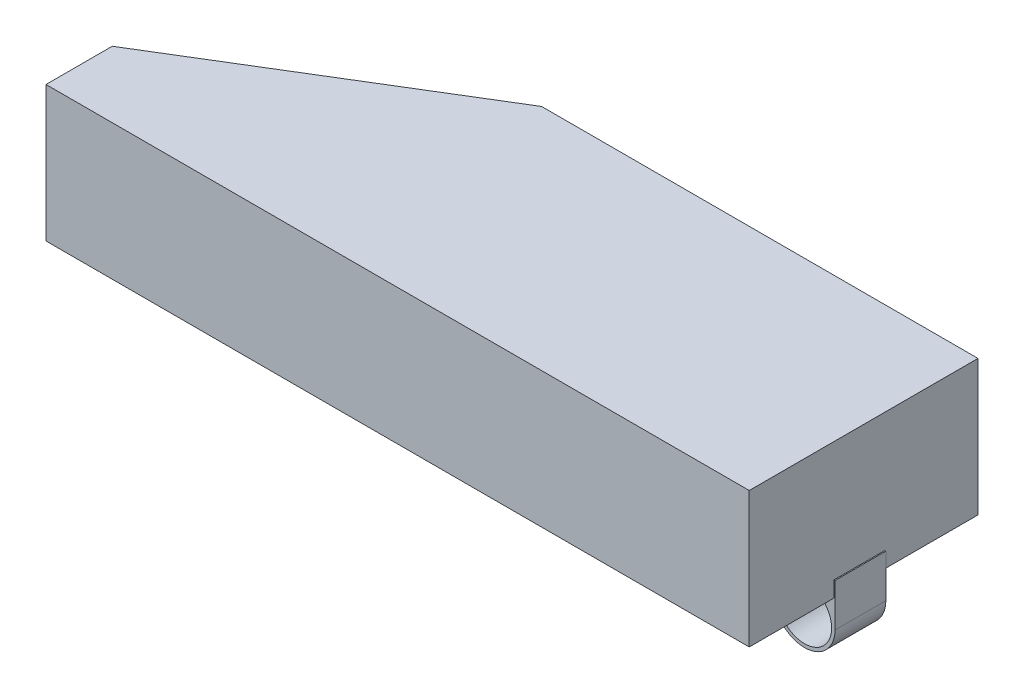
ISO-10303-21;
HEADER;
FILE_DESCRIPTION(('STEP AP214'),'2;1');
FILE_NAME('part.step','',(''),(''),'','','');
FILE_SCHEMA(('AUTOMOTIVE_DESIGN { 1 0 10303 214 1 1 1 1 }'));
ENDSEC;
DATA;
#1=APPLICATION_CONTEXT('core data for automotive mechanical design processes');
#2=APPLICATION_PROTOCOL_DEFINITION('international standard','automotive_design',2000,#1);
#3=PRODUCT_CONTEXT('',#1,'mechanical');
#4=PRODUCT('Part','Part','',(#3));
#5=PRODUCT_RELATED_PRODUCT_CATEGORY('part','',(#4));
#6=PRODUCT_DEFINITION_FORMATION('','',#4);
#7=PRODUCT_DEFINITION_CONTEXT('part definition',#1,'design');
#8=PRODUCT_DEFINITION('design','',#6,#7);
#9=PRODUCT_DEFINITION_SHAPE('','',#8);
#10=(LENGTH_UNIT() NAMED_UNIT(*) SI_UNIT(.MILLI.,.METRE.));
#11=(NAMED_UNIT(*) PLANE_ANGLE_UNIT() SI_UNIT($,.RADIAN.));
#12=(NAMED_UNIT(*) SI_UNIT($,.STERADIAN.) SOLID_ANGLE_UNIT());
#13=UNCERTAINTY_MEASURE_WITH_UNIT(LENGTH_MEASURE(1.E-05),#10,'distance_accuracy_value','');
#14=(GEOMETRIC_REPRESENTATION_CONTEXT(3) GLOBAL_UNCERTAINTY_ASSIGNED_CONTEXT((#13)) GLOBAL_UNIT_ASSIGNED_CONTEXT((#10,
#11,#12)) REPRESENTATION_CONTEXT('',''));
#15=CARTESIAN_POINT('',(0.,0.,0.));
#16=DIRECTION('',(0.,0.,1.));
#17=DIRECTION('',(1.,0.,0.));
#18=AXIS2_PLACEMENT_3D('',#15,#16,#17);
#19=CARTESIAN_POINT('',(0.,0.,0.));
#20=DIRECTION('',(0.,-1.,0.));
#21=DIRECTION('',(0.,0.,1.));
#22=AXIS2_PLACEMENT_3D('',#19,#20,#21);
#23=PLANE('',#22);
#24=DIRECTION('',(1.,0.,0.));
#25=VECTOR('',#24,1.);
#26=CARTESIAN_POINT('',(0.,0.,55.));
#27=LINE('',#26,#25);
#28=CARTESIAN_POINT('',(-35.3807674556755,0.,55.));
#29=VERTEX_POINT('',#28);
#30=CARTESIAN_POINT('',(-17.3807674556755,0.,55.));
#31=VERTEX_POINT('',#30);
#32=EDGE_CURVE('E274',#29,#31,#27,.T.);
#33=ORIENTED_EDGE('',*,*,#32,.F.);
#34=DIRECTION('',(0.,0.,-1.));
#35=VECTOR('',#34,1.);
#36=CARTESIAN_POINT('',(-35.3807674556755,0.,0.));
#37=LINE('',#36,#35);
#38=CARTESIAN_POINT('',(-35.3807674556755,0.,85.));
#39=VERTEX_POINT('',#38);
#40=EDGE_CURVE('E271',#39,#29,#37,.T.);
#41=ORIENTED_EDGE('',*,*,#40,.F.);
#42=DIRECTION('',(1.,0.,0.));
#43=VECTOR('',#42,1.);
#44=CARTESIAN_POINT('',(0.,0.,85.));
#45=LINE('',#44,#43);
#46=CARTESIAN_POINT('',(-17.3807674556755,0.,85.));
#47=VERTEX_POINT('',#46);
#48=EDGE_CURVE('E270',#39,#47,#45,.T.);
#49=ORIENTED_EDGE('',*,*,#48,.T.);
#50=CARTESIAN_POINT('',(0.,0.,85.));
#51=VERTEX_POINT('',#50);
#52=EDGE_CURVE('E267',#47,#51,#45,.T.);
#53=ORIENTED_EDGE('',*,*,#52,.T.);
#54=DIRECTION('',(0.,0.,-1.));
#55=VECTOR('',#54,1.);
#56=CARTESIAN_POINT('',(0.,0.,135.));
#57=LINE('',#56,#55);
#58=CARTESIAN_POINT('',(0.,0.,135.));
#59=VERTEX_POINT('',#58);
#60=EDGE_CURVE('E247',#59,#51,#57,.T.);
#61=ORIENTED_EDGE('',*,*,#60,.F.);
#62=DIRECTION('',(1.,0.,0.));
#63=VECTOR('',#62,1.);
#64=CARTESIAN_POINT('',(-415.,0.,135.));
#65=LINE('',#64,#63);
#66=CARTESIAN_POINT('',(-415.,0.,135.));
#67=VERTEX_POINT('',#66);
#68=EDGE_CURVE('E250',#67,#59,#65,.T.);
#69=ORIENTED_EDGE('',*,*,#68,.F.);
#70=DIRECTION('',(0.,0.,1.));
#71=VECTOR('',#70,1.);
#72=CARTESIAN_POINT('',(-415.,0.,95.9158718318107));
#73=LINE('',#72,#71);
#74=CARTESIAN_POINT('',(-415.,0.,95.9158718318107));
#75=VERTEX_POINT('',#74);
#76=EDGE_CURVE('E253',#75,#67,#73,.T.);
#77=ORIENTED_EDGE('',*,*,#76,.F.);
#78=DIRECTION('',(-0.854037132553677,0.,0.520212049283264));
#79=VECTOR('',#78,1.);
#80=CARTESIAN_POINT('',(-257.534328512037,0.,0.000206652732773205));
#81=LINE('',#80,#79);
#82=CARTESIAN_POINT('',(-257.534328512037,0.,0.000206652732773205));
#83=VERTEX_POINT('',#82);
#84=EDGE_CURVE('E234',#83,#75,#81,.T.);
#85=ORIENTED_EDGE('',*,*,#84,.F.);
#86=DIRECTION('',(0.999999999999678,0.,-8.02427909192227E-07));
#87=VECTOR('',#86,1.);
#88=CARTESIAN_POINT('',(-257.534328512037,0.,0.000206652732773205));
#89=LINE('',#88,#87);
#90=CARTESIAN_POINT('',(0.,0.,0.));
#91=VERTEX_POINT('',#90);
#92=EDGE_CURVE('E230',#83,#91,#89,.T.);
#93=ORIENTED_EDGE('',*,*,#92,.T.);
#94=CARTESIAN_POINT('',(0.,0.,55.));
#95=VERTEX_POINT('',#94);
#96=EDGE_CURVE('E246',#95,#91,#57,.T.);
#97=ORIENTED_EDGE('',*,*,#96,.F.);
#98=EDGE_CURVE('E277',#31,#95,#27,.T.);
#99=ORIENTED_EDGE('',*,*,#98,.F.);
#100=EDGE_LOOP('',(#33,#41,#49,#53,#61,#69,#77,#85,#93,#97,#99));
#101=FACE_BOUND('',#100,.T.);
#102=DIRECTION('',(0.,0.,-1.));
#103=VECTOR('',#102,1.);
#104=CARTESIAN_POINT('',(-235.380767455611,0.,0.));
#105=LINE('',#104,#103);
#106=CARTESIAN_POINT('',(-235.380767455611,0.,85.));
#107=VERTEX_POINT('',#106);
#108=CARTESIAN_POINT('',(-235.380767455611,0.,55.));
#109=VERTEX_POINT('',#108);
#110=EDGE_CURVE('E171',#107,#109,#105,.T.);
#111=ORIENTED_EDGE('',*,*,#110,.F.);
#112=DIRECTION('',(1.,0.,0.));
#113=VECTOR('',#112,1.);
#114=CARTESIAN_POINT('',(0.,0.,85.));
#115=LINE('',#114,#113);
#116=CARTESIAN_POINT('',(-217.380767455611,0.,85.));
#117=VERTEX_POINT('',#116);
#118=EDGE_CURVE('E284',#107,#117,#115,.T.);
#119=ORIENTED_EDGE('',*,*,#118,.T.);
#120=CARTESIAN_POINT('',(-199.380767455611,0.,85.));
#121=VERTEX_POINT('',#120);
#122=EDGE_CURVE('E281',#117,#121,#115,.T.);
#123=ORIENTED_EDGE('',*,*,#122,.T.);
#124=DIRECTION('',(0.,0.,1.));
#125=VECTOR('',#124,1.);
#126=CARTESIAN_POINT('',(-199.380767455611,0.,0.));
#127=LINE('',#126,#125);
#128=CARTESIAN_POINT('',(-199.380767455611,0.,55.));
#129=VERTEX_POINT('',#128);
#130=EDGE_CURVE('E285',#129,#121,#127,.T.);
#131=ORIENTED_EDGE('',*,*,#130,.F.);
#132=DIRECTION('',(1.,0.,0.));
#133=VECTOR('',#132,1.);
#134=CARTESIAN_POINT('',(0.,0.,55.));
#135=LINE('',#134,#133);
#136=CARTESIAN_POINT('',(-217.380767455611,0.,55.));
#137=VERTEX_POINT('',#136);
#138=EDGE_CURVE('E49',#137,#129,#135,.T.);
#139=ORIENTED_EDGE('',*,*,#138,.F.);
#140=EDGE_CURVE('E11',#109,#137,#135,.T.);
#141=ORIENTED_EDGE('',*,*,#140,.F.);
#142=EDGE_LOOP('',(#111,#119,#123,#131,#139,#141));
#143=FACE_BOUND('',#142,.T.);
#144=ADVANCED_FACE('F45',(#101,#143),#23,.T.);
#145=CARTESIAN_POINT('',(0.,80.,135.));
#146=DIRECTION('',(1.,0.,0.));
#147=DIRECTION('',(0.,0.,1.));
#148=AXIS2_PLACEMENT_3D('',#145,#146,#147);
#149=PLANE('',#148);
#150=ORIENTED_EDGE('',*,*,#96,.T.);
#151=DIRECTION('',(0.,-1.,0.));
#152=VECTOR('',#151,1.);
#153=CARTESIAN_POINT('',(0.,80.,0.));
#154=LINE('',#153,#152);
#155=CARTESIAN_POINT('',(0.,80.,0.));
#156=VERTEX_POINT('',#155);
#157=EDGE_CURVE('E265',#156,#91,#154,.T.);
#158=ORIENTED_EDGE('',*,*,#157,.F.);
#159=DIRECTION('',(0.,0.,-1.));
#160=VECTOR('',#159,1.);
#161=CARTESIAN_POINT('',(0.,80.,135.));
#162=LINE('',#161,#160);
#163=CARTESIAN_POINT('',(0.,80.,135.));
#164=VERTEX_POINT('',#163);
#165=EDGE_CURVE('E233',#164,#156,#162,.T.);
#166=ORIENTED_EDGE('',*,*,#165,.F.);
#167=DIRECTION('',(0.,-1.,0.));
#168=VECTOR('',#167,1.);
#169=CARTESIAN_POINT('',(0.,80.,135.));
#170=LINE('',#169,#168);
#171=EDGE_CURVE('E263',#164,#59,#170,.T.);
#172=ORIENTED_EDGE('',*,*,#171,.T.);
#173=ORIENTED_EDGE('',*,*,#60,.T.);
#174=DIRECTION('',(0.,1.,0.));
#175=VECTOR('',#174,1.);
#176=CARTESIAN_POINT('',(0.,80.,85.));
#177=LINE('',#176,#175);
#178=CARTESIAN_POINT('',(0.,9.30766354136547,85.));
#179=VERTEX_POINT('',#178);
#180=EDGE_CURVE('E219',#51,#179,#177,.T.);
#181=ORIENTED_EDGE('',*,*,#180,.T.);
#182=DIRECTION('',(0.,0.,1.));
#183=VECTOR('',#182,1.);
#184=CARTESIAN_POINT('',(0.,9.30766354136547,135.));
#185=LINE('',#184,#183);
#186=CARTESIAN_POINT('',(0.,9.30766354136547,55.));
#187=VERTEX_POINT('',#186);
#188=EDGE_CURVE('E278',#187,#179,#185,.T.);
#189=ORIENTED_EDGE('',*,*,#188,.F.);
#190=DIRECTION('',(0.,1.,0.));
#191=VECTOR('',#190,1.);
#192=CARTESIAN_POINT('',(0.,80.,55.));
#193=LINE('',#192,#191);
#194=EDGE_CURVE('E227',#95,#187,#193,.T.);
#195=ORIENTED_EDGE('',*,*,#194,.F.);
#196=EDGE_LOOP('',(#150,#158,#166,#172,#173,#181,#189,#195));
#197=FACE_BOUND('',#196,.T.);
#198=ADVANCED_FACE('F314',(#197),#149,.T.);
#199=CARTESIAN_POINT('',(-257.534328512037,80.,0.000206652732773205));
#200=DIRECTION('',(8.02427909192227E-07,0.,0.999999999999678));
#201=DIRECTION('',(-0.999999999999678,0.,8.02427909192227E-07));
#202=AXIS2_PLACEMENT_3D('',#199,#200,#201);
#203=PLANE('',#202);
#204=ORIENTED_EDGE('',*,*,#92,.F.);
#205=DIRECTION('',(0.,-1.,0.));
#206=VECTOR('',#205,1.);
#207=CARTESIAN_POINT('',(-257.534328512037,80.,0.000206652732773205));
#208=LINE('',#207,#206);
#209=CARTESIAN_POINT('',(-257.534328512037,80.,0.000206652732773205));
#210=VERTEX_POINT('',#209);
#211=EDGE_CURVE('E243',#210,#83,#208,.T.);
#212=ORIENTED_EDGE('',*,*,#211,.F.);
#213=DIRECTION('',(0.999999999999678,0.,-8.02427909192227E-07));
#214=VECTOR('',#213,1.);
#215=CARTESIAN_POINT('',(-257.534328512037,80.,0.000206652732773205));
#216=LINE('',#215,#214);
#217=EDGE_CURVE('E231',#210,#156,#216,.T.);
#218=ORIENTED_EDGE('',*,*,#217,.T.);
#219=ORIENTED_EDGE('',*,*,#157,.T.);
#220=EDGE_LOOP('',(#204,#212,#218,#219));
#221=FACE_BOUND('',#220,.T.);
#222=ADVANCED_FACE('F47',(#221),#203,.F.);
#223=CARTESIAN_POINT('',(-415.,80.,135.));
#224=DIRECTION('',(0.,0.,1.));
#225=DIRECTION('',(-1.,0.,0.));
#226=AXIS2_PLACEMENT_3D('',#223,#224,#225);
#227=PLANE('',#226);
#228=ORIENTED_EDGE('',*,*,#68,.T.);
#229=ORIENTED_EDGE('',*,*,#171,.F.);
#230=DIRECTION('',(1.,0.,0.));
#231=VECTOR('',#230,1.);
#232=CARTESIAN_POINT('',(-415.,80.,135.));
#233=LINE('',#232,#231);
#234=CARTESIAN_POINT('',(-415.,80.,135.));
#235=VERTEX_POINT('',#234);
#236=EDGE_CURVE('E237',#235,#164,#233,.T.);
#237=ORIENTED_EDGE('',*,*,#236,.F.);
#238=DIRECTION('',(0.,-1.,0.));
#239=VECTOR('',#238,1.);
#240=CARTESIAN_POINT('',(-415.,80.,135.));
#241=LINE('',#240,#239);
#242=EDGE_CURVE('E261',#235,#67,#241,.T.);
#243=ORIENTED_EDGE('',*,*,#242,.T.);
#244=EDGE_LOOP('',(#228,#229,#237,#243));
#245=FACE_BOUND('',#244,.T.);
#246=ADVANCED_FACE('F333',(#245),#227,.T.);
#247=CARTESIAN_POINT('',(-415.,80.,95.9158718318107));
#248=DIRECTION('',(-1.,0.,0.));
#249=DIRECTION('',(0.,0.,-1.));
#250=AXIS2_PLACEMENT_3D('',#247,#248,#249);
#251=PLANE('',#250);
#252=ORIENTED_EDGE('',*,*,#76,.T.);
#253=ORIENTED_EDGE('',*,*,#242,.F.);
#254=DIRECTION('',(0.,0.,1.));
#255=VECTOR('',#254,1.);
#256=CARTESIAN_POINT('',(-415.,80.,95.9158718318107));
#257=LINE('',#256,#255);
#258=CARTESIAN_POINT('',(-415.,80.,95.9158718318107));
#259=VERTEX_POINT('',#258);
#260=EDGE_CURVE('E239',#259,#235,#257,.T.);
#261=ORIENTED_EDGE('',*,*,#260,.F.);
#262=DIRECTION('',(0.,-1.,0.));
#263=VECTOR('',#262,1.);
#264=CARTESIAN_POINT('',(-415.,80.,95.9158718318107));
#265=LINE('',#264,#263);
#266=EDGE_CURVE('E259',#259,#75,#265,.T.);
#267=ORIENTED_EDGE('',*,*,#266,.T.);
#268=EDGE_LOOP('',(#252,#253,#261,#267));
#269=FACE_BOUND('',#268,.T.);
#270=ADVANCED_FACE('F329',(#269),#251,.T.);
#271=CARTESIAN_POINT('',(-257.534328512037,80.,0.000206652732773205));
#272=DIRECTION('',(-0.520212049283264,0.,-0.854037132553677));
#273=DIRECTION('',(0.854037132553677,0.,-0.520212049283264));
#274=AXIS2_PLACEMENT_3D('',#271,#272,#273);
#275=PLANE('',#274);
#276=ORIENTED_EDGE('',*,*,#84,.T.);
#277=ORIENTED_EDGE('',*,*,#266,.F.);
#278=DIRECTION('',(-0.854037132553677,0.,0.520212049283264));
#279=VECTOR('',#278,1.);
#280=CARTESIAN_POINT('',(-257.534328512037,80.,0.000206652732773205));
#281=LINE('',#280,#279);
#282=EDGE_CURVE('E241',#210,#259,#281,.T.);
#283=ORIENTED_EDGE('',*,*,#282,.F.);
#284=ORIENTED_EDGE('',*,*,#211,.T.);
#285=EDGE_LOOP('',(#276,#277,#283,#284));
#286=FACE_BOUND('',#285,.T.);
#287=ADVANCED_FACE('F326',(#286),#275,.T.);
#288=CARTESIAN_POINT('',(0.,80.,0.));
#289=DIRECTION('',(0.,-1.,0.));
#290=DIRECTION('',(0.,0.,1.));
#291=AXIS2_PLACEMENT_3D('',#288,#289,#290);
#292=PLANE('',#291);
#293=ORIENTED_EDGE('',*,*,#217,.F.);
#294=ORIENTED_EDGE('',*,*,#282,.T.);
#295=ORIENTED_EDGE('',*,*,#260,.T.);
#296=ORIENTED_EDGE('',*,*,#236,.T.);
#297=ORIENTED_EDGE('',*,*,#165,.T.);
#298=EDGE_LOOP('',(#293,#294,#295,#296,#297));
#299=FACE_BOUND('',#298,.T.);
#300=ADVANCED_FACE('F324',(#299),#292,.F.);
#301=CARTESIAN_POINT('',(-35.3807674556755,0.,55.));
#302=DIRECTION('',(1.,0.,0.));
#303=DIRECTION('',(0.,0.,1.));
#304=AXIS2_PLACEMENT_3D('',#301,#302,#303);
#305=PLANE('',#304);
#306=ORIENTED_EDGE('',*,*,#40,.T.);
#307=DIRECTION('',(0.,-1.,0.));
#308=VECTOR('',#307,1.);
#309=CARTESIAN_POINT('',(-35.3807674556755,0.,55.));
#310=LINE('',#309,#308);
#311=CARTESIAN_POINT('',(-35.3807674556755,-16.,55.));
#312=VERTEX_POINT('',#311);
#313=EDGE_CURVE('E194',#29,#312,#310,.T.);
#314=ORIENTED_EDGE('',*,*,#313,.T.);
#315=DIRECTION('',(0.,0.,1.));
#316=VECTOR('',#315,1.);
#317=CARTESIAN_POINT('',(-35.3807674556755,-16.,55.));
#318=LINE('',#317,#316);
#319=CARTESIAN_POINT('',(-35.3807674556755,-16.,85.));
#320=VERTEX_POINT('',#319);
#321=EDGE_CURVE('E216',#312,#320,#318,.T.);
#322=ORIENTED_EDGE('',*,*,#321,.T.);
#323=DIRECTION('',(0.,-1.,0.));
#324=VECTOR('',#323,1.);
#325=CARTESIAN_POINT('',(-35.3807674556755,0.,85.));
#326=LINE('',#325,#324);
#327=EDGE_CURVE('E207',#39,#320,#326,.T.);
#328=ORIENTED_EDGE('',*,*,#327,.F.);
#329=EDGE_LOOP('',(#306,#314,#322,#328));
#330=FACE_BOUND('',#329,.T.);
#331=ADVANCED_FACE('F370',(#330),#305,.F.);
#332=CARTESIAN_POINT('',(-17.3807674556755,-16.,55.));
#333=DIRECTION('',(0.,0.,1.));
#334=DIRECTION('',(-1.,0.,0.));
#335=AXIS2_PLACEMENT_3D('',#332,#333,#334);
#336=CYLINDRICAL_SURFACE('',#335,18.);
#337=CARTESIAN_POINT('',(-17.3807674556755,-16.,85.));
#338=DIRECTION('',(0.,0.,-1.));
#339=DIRECTION('',(-1.,0.,0.));
#340=AXIS2_PLACEMENT_3D('',#337,#338,#339);
#341=CIRCLE('',#340,18.);
#342=CARTESIAN_POINT('',(0.619232544324545,-16.,85.));
#343=VERTEX_POINT('',#342);
#344=EDGE_CURVE('E195',#343,#320,#341,.T.);
#345=ORIENTED_EDGE('',*,*,#344,.T.);
#346=ORIENTED_EDGE('',*,*,#321,.F.);
#347=CARTESIAN_POINT('',(-17.3807674556755,-16.,55.));
#348=DIRECTION('',(0.,0.,-1.));
#349=DIRECTION('',(-1.,0.,0.));
#350=AXIS2_PLACEMENT_3D('',#347,#348,#349);
#351=CIRCLE('',#350,18.);
#352=CARTESIAN_POINT('',(0.619232544324545,-16.,55.));
#353=VERTEX_POINT('',#352);
#354=EDGE_CURVE('E203',#353,#312,#351,.T.);
#355=ORIENTED_EDGE('',*,*,#354,.F.);
#356=DIRECTION('',(0.,0.,1.));
#357=VECTOR('',#356,1.);
#358=CARTESIAN_POINT('',(0.619232544324545,-16.,55.));
#359=LINE('',#358,#357);
#360=EDGE_CURVE('E220',#353,#343,#359,.T.);
#361=ORIENTED_EDGE('',*,*,#360,.T.);
#362=EDGE_LOOP('',(#345,#346,#355,#361));
#363=FACE_BOUND('',#362,.T.);
#364=ADVANCED_FACE('F387',(#363),#336,.T.);
#365=CARTESIAN_POINT('',(0.619232544324545,0.,55.));
#366=DIRECTION('',(-1.,0.,0.));
#367=DIRECTION('',(0.,0.,-1.));
#368=AXIS2_PLACEMENT_3D('',#365,#366,#367);
#369=PLANE('',#368);
#370=DIRECTION('',(0.,1.,0.));
#371=VECTOR('',#370,1.);
#372=CARTESIAN_POINT('',(0.619232544324545,0.,85.));
#373=LINE('',#372,#371);
#374=CARTESIAN_POINT('',(0.619232544324545,9.30766354136547,85.));
#375=VERTEX_POINT('',#374);
#376=EDGE_CURVE('E212',#343,#375,#373,.T.);
#377=ORIENTED_EDGE('',*,*,#376,.F.);
#378=ORIENTED_EDGE('',*,*,#360,.F.);
#379=DIRECTION('',(0.,1.,0.));
#380=VECTOR('',#379,1.);
#381=CARTESIAN_POINT('',(0.619232544324545,0.,55.));
#382=LINE('',#381,#380);
#383=CARTESIAN_POINT('',(0.619232544324545,9.30766354136547,55.));
#384=VERTEX_POINT('',#383);
#385=EDGE_CURVE('E200',#353,#384,#382,.T.);
#386=ORIENTED_EDGE('',*,*,#385,.T.);
#387=DIRECTION('',(0.,0.,1.));
#388=VECTOR('',#387,1.);
#389=CARTESIAN_POINT('',(0.619232544324545,9.30766354136547,55.));
#390=LINE('',#389,#388);
#391=EDGE_CURVE('E205',#384,#375,#390,.T.);
#392=ORIENTED_EDGE('',*,*,#391,.T.);
#393=EDGE_LOOP('',(#377,#378,#386,#392));
#394=FACE_BOUND('',#393,.T.);
#395=ADVANCED_FACE('F380',(#394),#369,.F.);
#396=CARTESIAN_POINT('',(-17.3807674556755,-16.,55.));
#397=DIRECTION('',(0.,0.,1.));
#398=DIRECTION('',(-1.,0.,0.));
#399=AXIS2_PLACEMENT_3D('',#396,#397,#398);
#400=CYLINDRICAL_SURFACE('',#399,16.);
#401=CARTESIAN_POINT('',(-17.3807674556755,-16.,85.));
#402=DIRECTION('',(0.,0.,-1.));
#403=DIRECTION('',(-1.,0.,0.));
#404=AXIS2_PLACEMENT_3D('',#401,#402,#403);
#405=CIRCLE('',#404,16.);
#406=EDGE_CURVE('E187',#47,#47,#405,.T.);
#407=ORIENTED_EDGE('',*,*,#406,.F.);
#408=EDGE_LOOP('',(#407));
#409=FACE_BOUND('',#408,.T.);
#410=CARTESIAN_POINT('',(-17.3807674556755,-16.,55.));
#411=DIRECTION('',(0.,0.,-1.));
#412=DIRECTION('',(-1.,0.,0.));
#413=AXIS2_PLACEMENT_3D('',#410,#411,#412);
#414=CIRCLE('',#413,16.);
#415=EDGE_CURVE('E192',#31,#31,#414,.T.);
#416=ORIENTED_EDGE('',*,*,#415,.T.);
#417=EDGE_LOOP('',(#416));
#418=FACE_BOUND('',#417,.T.);
#419=ADVANCED_FACE('F376',(#409,#418),#400,.F.);
#420=CARTESIAN_POINT('',(0.,9.30766354136547,55.));
#421=DIRECTION('',(0.,-1.,0.));
#422=DIRECTION('',(0.,0.,1.));
#423=AXIS2_PLACEMENT_3D('',#420,#421,#422);
#424=PLANE('',#423);
#425=ORIENTED_EDGE('',*,*,#188,.T.);
#426=DIRECTION('',(-1.,0.,0.));
#427=VECTOR('',#426,1.);
#428=CARTESIAN_POINT('',(0.,9.30766354136547,85.));
#429=LINE('',#428,#427);
#430=EDGE_CURVE('E210',#375,#179,#429,.T.);
#431=ORIENTED_EDGE('',*,*,#430,.F.);
#432=ORIENTED_EDGE('',*,*,#391,.F.);
#433=DIRECTION('',(-1.,0.,0.));
#434=VECTOR('',#433,1.);
#435=CARTESIAN_POINT('',(0.,9.30766354136547,55.));
#436=LINE('',#435,#434);
#437=EDGE_CURVE('E198',#384,#187,#436,.T.);
#438=ORIENTED_EDGE('',*,*,#437,.T.);
#439=EDGE_LOOP('',(#425,#431,#432,#438));
#440=FACE_BOUND('',#439,.T.);
#441=ADVANCED_FACE('F379',(#440),#424,.F.);
#442=CARTESIAN_POINT('',(0.,0.,55.));
#443=DIRECTION('',(0.,0.,1.));
#444=DIRECTION('',(-1.,0.,0.));
#445=AXIS2_PLACEMENT_3D('',#442,#443,#444);
#446=PLANE('',#445);
#447=ORIENTED_EDGE('',*,*,#194,.T.);
#448=ORIENTED_EDGE('',*,*,#437,.F.);
#449=ORIENTED_EDGE('',*,*,#385,.F.);
#450=ORIENTED_EDGE('',*,*,#354,.T.);
#451=ORIENTED_EDGE('',*,*,#313,.F.);
#452=ORIENTED_EDGE('',*,*,#32,.T.);
#453=ORIENTED_EDGE('',*,*,#415,.F.);
#454=ORIENTED_EDGE('',*,*,#98,.T.);
#455=EDGE_LOOP('',(#447,#448,#449,#450,#451,#452,#453,#454));
#456=FACE_BOUND('',#455,.T.);
#457=ADVANCED_FACE('F366',(#456),#446,.F.);
#458=CARTESIAN_POINT('',(0.,0.,85.));
#459=DIRECTION('',(0.,0.,1.));
#460=DIRECTION('',(-1.,0.,0.));
#461=AXIS2_PLACEMENT_3D('',#458,#459,#460);
#462=PLANE('',#461);
#463=ORIENTED_EDGE('',*,*,#52,.F.);
#464=ORIENTED_EDGE('',*,*,#406,.T.);
#465=ORIENTED_EDGE('',*,*,#48,.F.);
#466=ORIENTED_EDGE('',*,*,#327,.T.);
#467=ORIENTED_EDGE('',*,*,#344,.F.);
#468=ORIENTED_EDGE('',*,*,#376,.T.);
#469=ORIENTED_EDGE('',*,*,#430,.T.);
#470=ORIENTED_EDGE('',*,*,#180,.F.);
#471=EDGE_LOOP('',(#463,#464,#465,#466,#467,#468,#469,#470));
#472=FACE_BOUND('',#471,.T.);
#473=ADVANCED_FACE('F310',(#472),#462,.T.);
#474=CARTESIAN_POINT('',(-217.380767455611,-16.,55.));
#475=DIRECTION('',(0.,0.,1.));
#476=DIRECTION('',(-1.,0.,0.));
#477=AXIS2_PLACEMENT_3D('',#474,#475,#476);
#478=CYLINDRICAL_SURFACE('',#477,18.);
#479=CARTESIAN_POINT('',(-217.380767455611,-16.,85.));
#480=DIRECTION('',(0.,0.,-1.));
#481=DIRECTION('',(-1.,0.,0.));
#482=AXIS2_PLACEMENT_3D('',#479,#480,#481);
#483=CIRCLE('',#482,18.);
#484=CARTESIAN_POINT('',(-199.380767455611,-16.,85.));
#485=VERTEX_POINT('',#484);
#486=CARTESIAN_POINT('',(-235.380767455611,-16.,85.));
#487=VERTEX_POINT('',#486);
#488=EDGE_CURVE('E184',#485,#487,#483,.T.);
#489=ORIENTED_EDGE('',*,*,#488,.T.);
#490=DIRECTION('',(0.,0.,1.));
#491=VECTOR('',#490,1.);
#492=CARTESIAN_POINT('',(-235.380767455611,-16.,55.));
#493=LINE('',#492,#491);
#494=CARTESIAN_POINT('',(-235.380767455611,-16.,55.));
#495=VERTEX_POINT('',#494);
#496=EDGE_CURVE('E168',#495,#487,#493,.T.);
#497=ORIENTED_EDGE('',*,*,#496,.F.);
#498=CARTESIAN_POINT('',(-217.380767455611,-16.,55.));
#499=DIRECTION('',(0.,0.,-1.));
#500=DIRECTION('',(-1.,0.,0.));
#501=AXIS2_PLACEMENT_3D('',#498,#499,#500);
#502=CIRCLE('',#501,18.);
#503=CARTESIAN_POINT('',(-199.380767455611,-16.,55.));
#504=VERTEX_POINT('',#503);
#505=EDGE_CURVE('E174',#504,#495,#502,.T.);
#506=ORIENTED_EDGE('',*,*,#505,.F.);
#507=DIRECTION('',(0.,0.,1.));
#508=VECTOR('',#507,1.);
#509=CARTESIAN_POINT('',(-199.380767455611,-16.,55.));
#510=LINE('',#509,#508);
#511=EDGE_CURVE('E185',#504,#485,#510,.T.);
#512=ORIENTED_EDGE('',*,*,#511,.T.);
#513=EDGE_LOOP('',(#489,#497,#506,#512));
#514=FACE_BOUND('',#513,.T.);
#515=ADVANCED_FACE('F182',(#514),#478,.T.);
#516=CARTESIAN_POINT('',(-199.380767455611,0.,55.));
#517=DIRECTION('',(-1.,0.,0.));
#518=DIRECTION('',(0.,0.,-1.));
#519=AXIS2_PLACEMENT_3D('',#516,#517,#518);
#520=PLANE('',#519);
#521=ORIENTED_EDGE('',*,*,#130,.T.);
#522=DIRECTION('',(0.,1.,0.));
#523=VECTOR('',#522,1.);
#524=CARTESIAN_POINT('',(-199.380767455611,0.,85.));
#525=LINE('',#524,#523);
#526=EDGE_CURVE('E295',#485,#121,#525,.T.);
#527=ORIENTED_EDGE('',*,*,#526,.F.);
#528=ORIENTED_EDGE('',*,*,#511,.F.);
#529=DIRECTION('',(0.,1.,0.));
#530=VECTOR('',#529,1.);
#531=CARTESIAN_POINT('',(-199.380767455611,0.,55.));
#532=LINE('',#531,#530);
#533=EDGE_CURVE('E65',#504,#129,#532,.T.);
#534=ORIENTED_EDGE('',*,*,#533,.T.);
#535=EDGE_LOOP('',(#521,#527,#528,#534));
#536=FACE_BOUND('',#535,.T.);
#537=ADVANCED_FACE('F301',(#536),#520,.F.);
#538=CARTESIAN_POINT('',(-235.380767455611,0.,55.));
#539=DIRECTION('',(1.,0.,0.));
#540=DIRECTION('',(0.,0.,1.));
#541=AXIS2_PLACEMENT_3D('',#538,#539,#540);
#542=PLANE('',#541);
#543=ORIENTED_EDGE('',*,*,#110,.T.);
#544=DIRECTION('',(0.,-1.,0.));
#545=VECTOR('',#544,1.);
#546=CARTESIAN_POINT('',(-235.380767455611,0.,55.));
#547=LINE('',#546,#545);
#548=EDGE_CURVE('E164',#109,#495,#547,.T.);
#549=ORIENTED_EDGE('',*,*,#548,.T.);
#550=ORIENTED_EDGE('',*,*,#496,.T.);
#551=DIRECTION('',(0.,-1.,0.));
#552=VECTOR('',#551,1.);
#553=CARTESIAN_POINT('',(-235.380767455611,0.,85.));
#554=LINE('',#553,#552);
#555=EDGE_CURVE('E296',#107,#487,#554,.T.);
#556=ORIENTED_EDGE('',*,*,#555,.F.);
#557=EDGE_LOOP('',(#543,#549,#550,#556));
#558=FACE_BOUND('',#557,.T.);
#559=ADVANCED_FACE('F166',(#558),#542,.F.);
#560=CARTESIAN_POINT('',(-217.380767455611,-16.,55.));
#561=DIRECTION('',(0.,0.,1.));
#562=DIRECTION('',(-1.,0.,0.));
#563=AXIS2_PLACEMENT_3D('',#560,#561,#562);
#564=CYLINDRICAL_SURFACE('',#563,16.);
#565=CARTESIAN_POINT('',(-217.380767455611,-16.,85.));
#566=DIRECTION('',(0.,0.,-1.));
#567=DIRECTION('',(-1.,0.,0.));
#568=AXIS2_PLACEMENT_3D('',#565,#566,#567);
#569=CIRCLE('',#568,16.);
#570=EDGE_CURVE('E180',#117,#117,#569,.T.);
#571=ORIENTED_EDGE('',*,*,#570,.F.);
#572=EDGE_LOOP('',(#571));
#573=FACE_BOUND('',#572,.T.);
#574=CARTESIAN_POINT('',(-217.380767455611,-16.,55.));
#575=DIRECTION('',(0.,0.,-1.));
#576=DIRECTION('',(-1.,0.,0.));
#577=AXIS2_PLACEMENT_3D('',#574,#575,#576);
#578=CIRCLE('',#577,16.);
#579=EDGE_CURVE('E58',#137,#137,#578,.T.);
#580=ORIENTED_EDGE('',*,*,#579,.T.);
#581=EDGE_LOOP('',(#580));
#582=FACE_BOUND('',#581,.T.);
#583=ADVANCED_FACE('F308',(#573,#582),#564,.F.);
#584=CARTESIAN_POINT('',(0.,0.,55.));
#585=DIRECTION('',(0.,0.,1.));
#586=DIRECTION('',(-1.,0.,0.));
#587=AXIS2_PLACEMENT_3D('',#584,#585,#586);
#588=PLANE('',#587);
#589=ORIENTED_EDGE('',*,*,#140,.T.);
#590=ORIENTED_EDGE('',*,*,#579,.F.);
#591=ORIENTED_EDGE('',*,*,#138,.T.);
#592=ORIENTED_EDGE('',*,*,#533,.F.);
#593=ORIENTED_EDGE('',*,*,#505,.T.);
#594=ORIENTED_EDGE('',*,*,#548,.F.);
#595=EDGE_LOOP('',(#589,#590,#591,#592,#593,#594));
#596=FACE_BOUND('',#595,.T.);
#597=ADVANCED_FACE('F177',(#596),#588,.F.);
#598=CARTESIAN_POINT('',(0.,0.,85.));
#599=DIRECTION('',(0.,0.,1.));
#600=DIRECTION('',(-1.,0.,0.));
#601=AXIS2_PLACEMENT_3D('',#598,#599,#600);
#602=PLANE('',#601);
#603=ORIENTED_EDGE('',*,*,#555,.T.);
#604=ORIENTED_EDGE('',*,*,#488,.F.);
#605=ORIENTED_EDGE('',*,*,#526,.T.);
#606=ORIENTED_EDGE('',*,*,#122,.F.);
#607=ORIENTED_EDGE('',*,*,#570,.T.);
#608=ORIENTED_EDGE('',*,*,#118,.F.);
#609=EDGE_LOOP('',(#603,#604,#605,#606,#607,#608));
#610=FACE_BOUND('',#609,.T.);
#611=ADVANCED_FACE('F293',(#610),#602,.T.);
#612=CLOSED_SHELL('',(#144,#198,#222,#246,#270,#287,#300,#331,#364,#395,#419,#441,#457,#473,
#515,#537,#559,#583,#597,#611));
#613=MANIFOLD_SOLID_BREP('B2',#612);
#614=ADVANCED_BREP_SHAPE_REPRESENTATION('',(#18,#613),#14);
#615=SHAPE_DEFINITION_REPRESENTATION(#9,#614);
ENDSEC;
END-ISO-10303-21;
